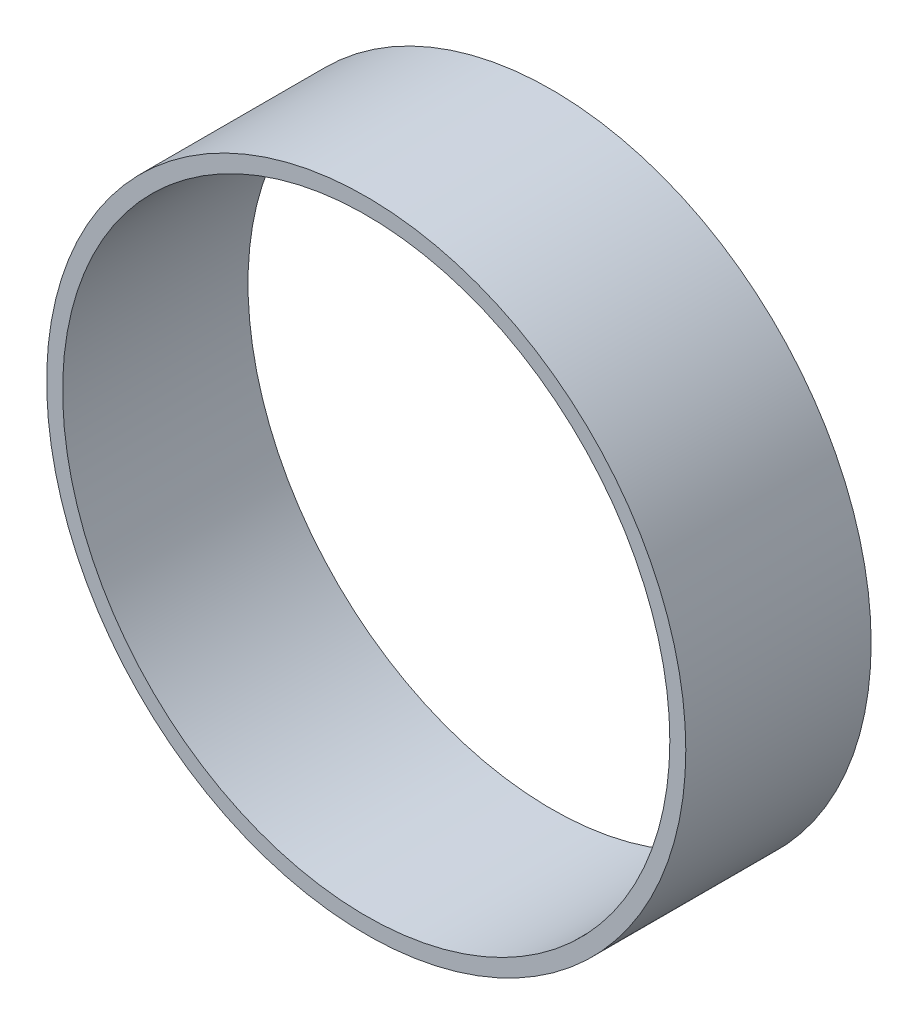
ISO-10303-21;
HEADER;
FILE_DESCRIPTION(('STEP AP214'),'2;1');
FILE_NAME('part.step','',(''),(''),'','','');
FILE_SCHEMA(('AUTOMOTIVE_DESIGN { 1 0 10303 214 1 1 1 1 }'));
ENDSEC;
DATA;
#1=APPLICATION_CONTEXT('core data for automotive mechanical design processes');
#2=APPLICATION_PROTOCOL_DEFINITION('international standard','automotive_design',2000,#1);
#3=PRODUCT_CONTEXT('',#1,'mechanical');
#4=PRODUCT('Part','Part','',(#3));
#5=PRODUCT_RELATED_PRODUCT_CATEGORY('part','',(#4));
#6=PRODUCT_DEFINITION_FORMATION('','',#4);
#7=PRODUCT_DEFINITION_CONTEXT('part definition',#1,'design');
#8=PRODUCT_DEFINITION('design','',#6,#7);
#9=PRODUCT_DEFINITION_SHAPE('','',#8);
#10=(LENGTH_UNIT() NAMED_UNIT(*) SI_UNIT(.MILLI.,.METRE.));
#11=(NAMED_UNIT(*) PLANE_ANGLE_UNIT() SI_UNIT($,.RADIAN.));
#12=(NAMED_UNIT(*) SI_UNIT($,.STERADIAN.) SOLID_ANGLE_UNIT());
#13=UNCERTAINTY_MEASURE_WITH_UNIT(LENGTH_MEASURE(1.E-05),#10,'distance_accuracy_value','');
#14=(GEOMETRIC_REPRESENTATION_CONTEXT(3) GLOBAL_UNCERTAINTY_ASSIGNED_CONTEXT((#13)) GLOBAL_UNIT_ASSIGNED_CONTEXT((#10,
#11,#12)) REPRESENTATION_CONTEXT('',''));
#15=CARTESIAN_POINT('',(0.,0.,0.));
#16=DIRECTION('',(0.,0.,1.));
#17=DIRECTION('',(1.,0.,0.));
#18=AXIS2_PLACEMENT_3D('',#15,#16,#17);
#19=CARTESIAN_POINT('',(-43.2126646474919,1.44186566085188,5.8));
#20=DIRECTION('',(0.,0.,-1.));
#21=DIRECTION('',(-1.,0.,0.));
#22=AXIS2_PLACEMENT_3D('',#19,#20,#21);
#23=CYLINDRICAL_SURFACE('',#22,10.);
#24=CARTESIAN_POINT('',(-43.2126646474919,1.44186566085188,5.8));
#25=DIRECTION('',(0.,0.,1.));
#26=DIRECTION('',(1.,0.,0.));
#27=AXIS2_PLACEMENT_3D('',#24,#25,#26);
#28=CIRCLE('',#27,10.);
#29=CARTESIAN_POINT('',(-33.2126646474919,1.44186566085188,5.8));
#30=VERTEX_POINT('',#29);
#31=EDGE_CURVE('E10',#30,#30,#28,.T.);
#32=ORIENTED_EDGE('',*,*,#31,.F.);
#33=EDGE_LOOP('',(#32));
#34=FACE_BOUND('',#33,.T.);
#35=CARTESIAN_POINT('',(-43.2126646474919,1.44186566085188,0.));
#36=DIRECTION('',(0.,0.,1.));
#37=DIRECTION('',(1.,0.,0.));
#38=AXIS2_PLACEMENT_3D('',#35,#36,#37);
#39=CIRCLE('',#38,10.);
#40=CARTESIAN_POINT('',(-33.2126646474919,1.44186566085188,0.));
#41=VERTEX_POINT('',#40);
#42=EDGE_CURVE('E42',#41,#41,#39,.T.);
#43=ORIENTED_EDGE('',*,*,#42,.T.);
#44=EDGE_LOOP('',(#43));
#45=FACE_BOUND('',#44,.T.);
#46=ADVANCED_FACE('F39',(#34,#45),#23,.T.);
#47=CARTESIAN_POINT('',(-43.2126646474919,1.44186566085188,5.8));
#48=DIRECTION('',(0.,0.,1.));
#49=DIRECTION('',(1.,0.,0.));
#50=AXIS2_PLACEMENT_3D('',#47,#48,#49);
#51=PLANE('',#50);
#52=CARTESIAN_POINT('',(-43.2126646474919,1.44186566085188,5.8));
#53=DIRECTION('',(0.,0.,1.));
#54=DIRECTION('',(1.,0.,0.));
#55=AXIS2_PLACEMENT_3D('',#52,#53,#54);
#56=CIRCLE('',#55,9.5);
#57=CARTESIAN_POINT('',(-33.7126646474919,1.44186566085188,5.8));
#58=VERTEX_POINT('',#57);
#59=EDGE_CURVE('E53',#58,#58,#56,.T.);
#60=ORIENTED_EDGE('',*,*,#59,.F.);
#61=EDGE_LOOP('',(#60));
#62=FACE_BOUND('',#61,.T.);
#63=ORIENTED_EDGE('',*,*,#31,.T.);
#64=EDGE_LOOP('',(#63));
#65=FACE_BOUND('',#64,.T.);
#66=ADVANCED_FACE('F70',(#62,#65),#51,.T.);
#67=CARTESIAN_POINT('',(-43.2126646474919,1.44186566085188,0.));
#68=DIRECTION('',(0.,0.,1.));
#69=DIRECTION('',(1.,0.,0.));
#70=AXIS2_PLACEMENT_3D('',#67,#68,#69);
#71=PLANE('',#70);
#72=CARTESIAN_POINT('',(-43.2126646474919,1.44186566085188,0.));
#73=DIRECTION('',(0.,0.,1.));
#74=DIRECTION('',(1.,0.,0.));
#75=AXIS2_PLACEMENT_3D('',#72,#73,#74);
#76=CIRCLE('',#75,9.5);
#77=CARTESIAN_POINT('',(-33.7126646474919,1.44186566085188,0.));
#78=VERTEX_POINT('',#77);
#79=EDGE_CURVE('E51',#78,#78,#76,.T.);
#80=ORIENTED_EDGE('',*,*,#79,.T.);
#81=EDGE_LOOP('',(#80));
#82=FACE_BOUND('',#81,.T.);
#83=ORIENTED_EDGE('',*,*,#42,.F.);
#84=EDGE_LOOP('',(#83));
#85=FACE_BOUND('',#84,.T.);
#86=ADVANCED_FACE('F61',(#82,#85),#71,.F.);
#87=CARTESIAN_POINT('',(-43.2126646474919,1.44186566085188,0.));
#88=DIRECTION('',(0.,0.,1.));
#89=DIRECTION('',(1.,0.,0.));
#90=AXIS2_PLACEMENT_3D('',#87,#88,#89);
#91=CYLINDRICAL_SURFACE('',#90,9.5);
#92=ORIENTED_EDGE('',*,*,#79,.F.);
#93=EDGE_LOOP('',(#92));
#94=FACE_BOUND('',#93,.T.);
#95=ORIENTED_EDGE('',*,*,#59,.T.);
#96=EDGE_LOOP('',(#95));
#97=FACE_BOUND('',#96,.T.);
#98=ADVANCED_FACE('F64',(#94,#97),#91,.F.);
#99=CLOSED_SHELL('',(#46,#66,#86,#98));
#100=MANIFOLD_SOLID_BREP('B2',#99);
#101=ADVANCED_BREP_SHAPE_REPRESENTATION('',(#18,#100),#14);
#102=SHAPE_DEFINITION_REPRESENTATION(#9,#101);
ENDSEC;
END-ISO-10303-21;
